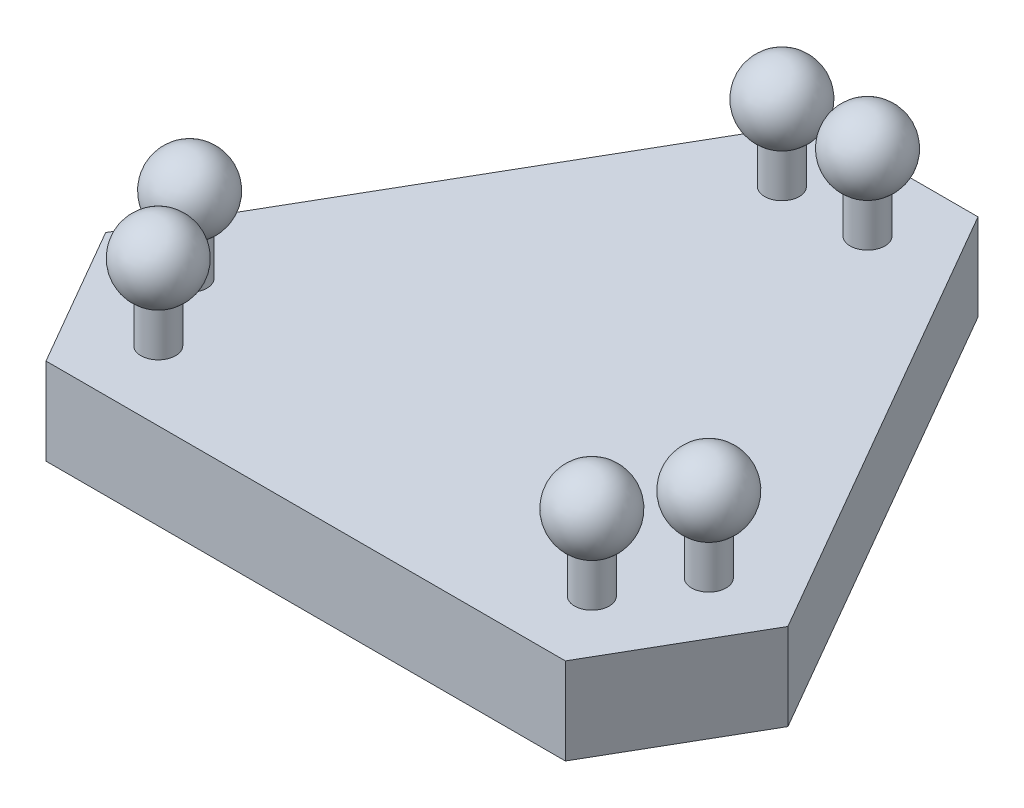
ISO-10303-21;
HEADER;
FILE_DESCRIPTION(('STEP AP214'),'2;1');
FILE_NAME('part.step','',(''),(''),'','','');
FILE_SCHEMA(('AUTOMOTIVE_DESIGN { 1 0 10303 214 1 1 1 1 }'));
ENDSEC;
DATA;
#1=APPLICATION_CONTEXT('core data for automotive mechanical design processes');
#2=APPLICATION_PROTOCOL_DEFINITION('international standard','automotive_design',2000,#1);
#3=PRODUCT_CONTEXT('',#1,'mechanical');
#4=PRODUCT('Part','Part','',(#3));
#5=PRODUCT_RELATED_PRODUCT_CATEGORY('part','',(#4));
#6=PRODUCT_DEFINITION_FORMATION('','',#4);
#7=PRODUCT_DEFINITION_CONTEXT('part definition',#1,'design');
#8=PRODUCT_DEFINITION('design','',#6,#7);
#9=PRODUCT_DEFINITION_SHAPE('','',#8);
#10=(LENGTH_UNIT() NAMED_UNIT(*) SI_UNIT(.MILLI.,.METRE.));
#11=(NAMED_UNIT(*) PLANE_ANGLE_UNIT() SI_UNIT($,.RADIAN.));
#12=(NAMED_UNIT(*) SI_UNIT($,.STERADIAN.) SOLID_ANGLE_UNIT());
#13=UNCERTAINTY_MEASURE_WITH_UNIT(LENGTH_MEASURE(1.E-05),#10,'distance_accuracy_value','');
#14=(GEOMETRIC_REPRESENTATION_CONTEXT(3) GLOBAL_UNCERTAINTY_ASSIGNED_CONTEXT((#13)) GLOBAL_UNIT_ASSIGNED_CONTEXT((#10,
#11,#12)) REPRESENTATION_CONTEXT('',''));
#15=CARTESIAN_POINT('',(0.,0.,0.));
#16=DIRECTION('',(0.,0.,1.));
#17=DIRECTION('',(1.,0.,0.));
#18=AXIS2_PLACEMENT_3D('',#15,#16,#17);
#19=CARTESIAN_POINT('',(-9.39181935057106,10.,-40.));
#20=DIRECTION('',(0.,0.,1.));
#21=DIRECTION('',(1.,0.,0.));
#22=AXIS2_PLACEMENT_3D('',#19,#20,#21);
#23=PLANE('',#22);
#24=DIRECTION('',(-1.,0.,0.));
#25=VECTOR('',#24,1.);
#26=CARTESIAN_POINT('',(-9.39181935057106,0.,-40.));
#27=LINE('',#26,#25);
#28=CARTESIAN_POINT('',(9.39181935056225,0.,-40.));
#29=VERTEX_POINT('',#28);
#30=CARTESIAN_POINT('',(-9.39181935057106,0.,-40.));
#31=VERTEX_POINT('',#30);
#32=EDGE_CURVE('E119',#29,#31,#27,.T.);
#33=ORIENTED_EDGE('',*,*,#32,.T.);
#34=DIRECTION('',(0.,-1.,0.));
#35=VECTOR('',#34,1.);
#36=CARTESIAN_POINT('',(-9.39181935057106,10.,-40.));
#37=LINE('',#36,#35);
#38=CARTESIAN_POINT('',(-9.39181935057106,10.,-40.));
#39=VERTEX_POINT('',#38);
#40=EDGE_CURVE('E11',#39,#31,#37,.T.);
#41=ORIENTED_EDGE('',*,*,#40,.F.);
#42=DIRECTION('',(-1.,0.,0.));
#43=VECTOR('',#42,1.);
#44=CARTESIAN_POINT('',(-9.39181935057106,10.,-40.));
#45=LINE('',#44,#43);
#46=CARTESIAN_POINT('',(9.39181935056225,10.,-40.));
#47=VERTEX_POINT('',#46);
#48=EDGE_CURVE('E130',#47,#39,#45,.T.);
#49=ORIENTED_EDGE('',*,*,#48,.F.);
#50=DIRECTION('',(0.,-1.,0.));
#51=VECTOR('',#50,1.);
#52=CARTESIAN_POINT('',(9.39181935056225,10.,-40.));
#53=LINE('',#52,#51);
#54=EDGE_CURVE('E115',#47,#29,#53,.T.);
#55=ORIENTED_EDGE('',*,*,#54,.T.);
#56=EDGE_LOOP('',(#33,#41,#49,#55));
#57=FACE_BOUND('',#56,.T.);
#58=ADVANCED_FACE('F32',(#57),#23,.F.);
#59=CARTESIAN_POINT('',(-9.39181935057106,10.,-40.));
#60=DIRECTION('',(0.866025403784503,0.,0.49999999999989));
#61=DIRECTION('',(0.49999999999989,0.,-0.866025403784503));
#62=AXIS2_PLACEMENT_3D('',#59,#60,#61);
#63=PLANE('',#62);
#64=DIRECTION('',(-0.499999999999889,0.,0.866025403784502));
#65=VECTOR('',#64,1.);
#66=CARTESIAN_POINT('',(-9.39181935057106,0.,-40.));
#67=LINE('',#66,#65);
#68=CARTESIAN_POINT('',(-39.3369258266587,0.,11.8664458546588));
#69=VERTEX_POINT('',#68);
#70=EDGE_CURVE('E122',#31,#69,#67,.T.);
#71=ORIENTED_EDGE('',*,*,#70,.T.);
#72=DIRECTION('',(0.,-1.,0.));
#73=VECTOR('',#72,1.);
#74=CARTESIAN_POINT('',(-39.3369258266587,10.,11.8664458546588));
#75=LINE('',#74,#73);
#76=CARTESIAN_POINT('',(-39.3369258266587,10.,11.8664458546588));
#77=VERTEX_POINT('',#76);
#78=EDGE_CURVE('E42',#77,#69,#75,.T.);
#79=ORIENTED_EDGE('',*,*,#78,.F.);
#80=DIRECTION('',(-0.499999999999889,0.,0.866025403784502));
#81=VECTOR('',#80,1.);
#82=CARTESIAN_POINT('',(-9.39181935057106,10.,-40.));
#83=LINE('',#82,#81);
#84=EDGE_CURVE('E88',#39,#77,#83,.T.);
#85=ORIENTED_EDGE('',*,*,#84,.F.);
#86=ORIENTED_EDGE('',*,*,#40,.T.);
#87=EDGE_LOOP('',(#71,#79,#85,#86));
#88=FACE_BOUND('',#87,.T.);
#89=ADVANCED_FACE('F180',(#88),#63,.F.);
#90=CARTESIAN_POINT('',(-29.945106476092,10.,28.1335541453488));
#91=DIRECTION('',(0.866025403784438,0.,-0.500000000000001));
#92=DIRECTION('',(-0.500000000000001,0.,-0.866025403784438));
#93=AXIS2_PLACEMENT_3D('',#90,#91,#92);
#94=PLANE('',#93);
#95=DIRECTION('',(0.500000000000001,0.,0.866025403784438));
#96=VECTOR('',#95,1.);
#97=CARTESIAN_POINT('',(-29.945106476092,0.,28.1335541453488));
#98=LINE('',#97,#96);
#99=CARTESIAN_POINT('',(-29.945106476092,0.,28.1335541453488));
#100=VERTEX_POINT('',#99);
#101=EDGE_CURVE('E125',#69,#100,#98,.T.);
#102=ORIENTED_EDGE('',*,*,#101,.T.);
#103=DIRECTION('',(0.,-1.,0.));
#104=VECTOR('',#103,1.);
#105=CARTESIAN_POINT('',(-29.945106476092,10.,28.1335541453488));
#106=LINE('',#105,#104);
#107=CARTESIAN_POINT('',(-29.945106476092,10.,28.1335541453488));
#108=VERTEX_POINT('',#107);
#109=EDGE_CURVE('E110',#108,#100,#106,.T.);
#110=ORIENTED_EDGE('',*,*,#109,.F.);
#111=DIRECTION('',(0.500000000000001,0.,0.866025403784438));
#112=VECTOR('',#111,1.);
#113=CARTESIAN_POINT('',(-29.945106476092,10.,28.1335541453488));
#114=LINE('',#113,#112);
#115=EDGE_CURVE('E101',#77,#108,#114,.T.);
#116=ORIENTED_EDGE('',*,*,#115,.F.);
#117=ORIENTED_EDGE('',*,*,#78,.T.);
#118=EDGE_LOOP('',(#102,#110,#116,#117));
#119=FACE_BOUND('',#118,.T.);
#120=ADVANCED_FACE('F183',(#119),#94,.F.);
#121=CARTESIAN_POINT('',(-29.945106476092,10.,28.1335541453488));
#122=DIRECTION('',(-1.27793834730888E-13,0.,-1.));
#123=DIRECTION('',(-1.,0.,1.27793834730888E-13));
#124=AXIS2_PLACEMENT_3D('',#121,#122,#123);
#125=PLANE('',#124);
#126=DIRECTION('',(1.,0.,-1.27793834730888E-13));
#127=VECTOR('',#126,1.);
#128=CARTESIAN_POINT('',(-29.945106476092,0.,28.1335541453488));
#129=LINE('',#128,#127);
#130=CARTESIAN_POINT('',(29.9451064760964,0.,28.1335541453412));
#131=VERTEX_POINT('',#130);
#132=EDGE_CURVE('E109',#100,#131,#129,.T.);
#133=ORIENTED_EDGE('',*,*,#132,.T.);
#134=DIRECTION('',(0.,-1.,0.));
#135=VECTOR('',#134,1.);
#136=CARTESIAN_POINT('',(29.9451064760964,10.,28.1335541453412));
#137=LINE('',#136,#135);
#138=CARTESIAN_POINT('',(29.9451064760964,10.,28.1335541453412));
#139=VERTEX_POINT('',#138);
#140=EDGE_CURVE('E106',#139,#131,#137,.T.);
#141=ORIENTED_EDGE('',*,*,#140,.F.);
#142=DIRECTION('',(1.,0.,-1.27793834730888E-13));
#143=VECTOR('',#142,1.);
#144=CARTESIAN_POINT('',(-29.945106476092,10.,28.1335541453488));
#145=LINE('',#144,#143);
#146=EDGE_CURVE('E95',#108,#139,#145,.T.);
#147=ORIENTED_EDGE('',*,*,#146,.F.);
#148=ORIENTED_EDGE('',*,*,#109,.T.);
#149=EDGE_LOOP('',(#133,#141,#147,#148));
#150=FACE_BOUND('',#149,.T.);
#151=ADVANCED_FACE('F107',(#150),#125,.F.);
#152=CARTESIAN_POINT('',(39.3369258266631,10.,11.8664458546512));
#153=DIRECTION('',(-0.866025403784438,0.,-0.5));
#154=DIRECTION('',(-0.5,0.,0.866025403784438));
#155=AXIS2_PLACEMENT_3D('',#152,#153,#154);
#156=PLANE('',#155);
#157=DIRECTION('',(0.5,0.,-0.866025403784438));
#158=VECTOR('',#157,1.);
#159=CARTESIAN_POINT('',(39.3369258266631,0.,11.8664458546512));
#160=LINE('',#159,#158);
#161=CARTESIAN_POINT('',(39.3369258266631,0.,11.8664458546512));
#162=VERTEX_POINT('',#161);
#163=EDGE_CURVE('E74',#131,#162,#160,.T.);
#164=ORIENTED_EDGE('',*,*,#163,.T.);
#165=DIRECTION('',(0.,-1.,0.));
#166=VECTOR('',#165,1.);
#167=CARTESIAN_POINT('',(39.3369258266631,10.,11.8664458546512));
#168=LINE('',#167,#166);
#169=CARTESIAN_POINT('',(39.3369258266631,10.,11.8664458546512));
#170=VERTEX_POINT('',#169);
#171=EDGE_CURVE('E111',#170,#162,#168,.T.);
#172=ORIENTED_EDGE('',*,*,#171,.F.);
#173=DIRECTION('',(0.5,0.,-0.866025403784438));
#174=VECTOR('',#173,1.);
#175=CARTESIAN_POINT('',(39.3369258266631,10.,11.8664458546512));
#176=LINE('',#175,#174);
#177=EDGE_CURVE('E99',#139,#170,#176,.T.);
#178=ORIENTED_EDGE('',*,*,#177,.F.);
#179=ORIENTED_EDGE('',*,*,#140,.T.);
#180=EDGE_LOOP('',(#164,#172,#178,#179));
#181=FACE_BOUND('',#180,.T.);
#182=ADVANCED_FACE('F113',(#181),#156,.F.);
#183=CARTESIAN_POINT('',(39.3369258266631,10.,11.8664458546512));
#184=DIRECTION('',(-0.866025403784375,0.,0.50000000000011));
#185=DIRECTION('',(0.50000000000011,0.,0.866025403784375));
#186=AXIS2_PLACEMENT_3D('',#183,#184,#185);
#187=PLANE('',#186);
#188=DIRECTION('',(-0.50000000000011,0.,-0.866025403784375));
#189=VECTOR('',#188,1.);
#190=CARTESIAN_POINT('',(39.3369258266631,0.,11.8664458546512));
#191=LINE('',#190,#189);
#192=EDGE_CURVE('E80',#162,#29,#191,.T.);
#193=ORIENTED_EDGE('',*,*,#192,.T.);
#194=ORIENTED_EDGE('',*,*,#54,.F.);
#195=DIRECTION('',(-0.50000000000011,0.,-0.866025403784375));
#196=VECTOR('',#195,1.);
#197=CARTESIAN_POINT('',(39.3369258266631,10.,11.8664458546512));
#198=LINE('',#197,#196);
#199=EDGE_CURVE('E51',#170,#47,#198,.T.);
#200=ORIENTED_EDGE('',*,*,#199,.F.);
#201=ORIENTED_EDGE('',*,*,#171,.T.);
#202=EDGE_LOOP('',(#193,#194,#200,#201));
#203=FACE_BOUND('',#202,.T.);
#204=ADVANCED_FACE('F188',(#203),#187,.F.);
#205=CARTESIAN_POINT('',(0.,10.,0.));
#206=DIRECTION('',(0.,1.,0.));
#207=DIRECTION('',(0.,0.,1.));
#208=AXIS2_PLACEMENT_3D('',#205,#206,#207);
#209=PLANE('',#208);
#210=CARTESIAN_POINT('',(25.000000000001,10.,20.133554145342));
#211=DIRECTION('',(0.,1.,0.));
#212=DIRECTION('',(0.,0.,1.));
#213=AXIS2_PLACEMENT_3D('',#210,#211,#212);
#214=CIRCLE('',#213,1.99999999999999);
#215=CARTESIAN_POINT('',(25.000000000001,10.,22.133554145342));
#216=VERTEX_POINT('',#215);
#217=EDGE_CURVE('E155',#216,#216,#214,.T.);
#218=ORIENTED_EDGE('',*,*,#217,.F.);
#219=EDGE_LOOP('',(#218));
#220=FACE_BOUND('',#219,.T.);
#221=CARTESIAN_POINT('',(-24.999999999999,10.,20.1335541453479));
#222=DIRECTION('',(0.,1.,0.));
#223=DIRECTION('',(0.,0.,1.));
#224=AXIS2_PLACEMENT_3D('',#221,#222,#223);
#225=CIRCLE('',#224,2.);
#226=CARTESIAN_POINT('',(-24.999999999999,10.,22.1335541453479));
#227=VERTEX_POINT('',#226);
#228=EDGE_CURVE('E154',#227,#227,#225,.T.);
#229=ORIENTED_EDGE('',*,*,#228,.F.);
#230=EDGE_LOOP('',(#229));
#231=FACE_BOUND('',#230,.T.);
#232=CARTESIAN_POINT('',(4.93616935833503,10.,-31.7174121672829));
#233=DIRECTION('',(0.,1.,0.));
#234=DIRECTION('',(0.,0.,1.));
#235=AXIS2_PLACEMENT_3D('',#232,#233,#234);
#236=CIRCLE('',#235,2.);
#237=CARTESIAN_POINT('',(4.93616935833503,10.,-29.7174121672829));
#238=VERTEX_POINT('',#237);
#239=EDGE_CURVE('E149',#238,#238,#236,.T.);
#240=ORIENTED_EDGE('',*,*,#239,.F.);
#241=EDGE_LOOP('',(#240));
#242=FACE_BOUND('',#241,.T.);
#243=CARTESIAN_POINT('',(29.9361693583404,10.,11.583858021936));
#244=DIRECTION('',(0.,1.,0.));
#245=DIRECTION('',(0.,0.,1.));
#246=AXIS2_PLACEMENT_3D('',#243,#244,#245);
#247=CIRCLE('',#246,2.);
#248=CARTESIAN_POINT('',(29.9361693583404,10.,13.583858021936));
#249=VERTEX_POINT('',#248);
#250=EDGE_CURVE('E148',#249,#249,#247,.T.);
#251=ORIENTED_EDGE('',*,*,#250,.F.);
#252=EDGE_LOOP('',(#251));
#253=FACE_BOUND('',#252,.T.);
#254=CARTESIAN_POINT('',(-29.9361693583361,10.,11.5838580219411));
#255=DIRECTION('',(0.,1.,0.));
#256=DIRECTION('',(0.,0.,1.));
#257=AXIS2_PLACEMENT_3D('',#254,#255,#256);
#258=CIRCLE('',#257,2.);
#259=CARTESIAN_POINT('',(-29.9361693583361,10.,13.5838580219411));
#260=VERTEX_POINT('',#259);
#261=EDGE_CURVE('E140',#260,#260,#258,.T.);
#262=ORIENTED_EDGE('',*,*,#261,.F.);
#263=EDGE_LOOP('',(#262));
#264=FACE_BOUND('',#263,.T.);
#265=CARTESIAN_POINT('',(-4.93616935834163,10.,-31.717412167284));
#266=DIRECTION('',(0.,1.,0.));
#267=DIRECTION('',(0.,0.,1.));
#268=AXIS2_PLACEMENT_3D('',#265,#266,#267);
#269=CIRCLE('',#268,2.00000000000001);
#270=CARTESIAN_POINT('',(-4.93616935834163,10.,-29.717412167284));
#271=VERTEX_POINT('',#270);
#272=EDGE_CURVE('E139',#271,#271,#269,.T.);
#273=ORIENTED_EDGE('',*,*,#272,.F.);
#274=EDGE_LOOP('',(#273));
#275=FACE_BOUND('',#274,.T.);
#276=ORIENTED_EDGE('',*,*,#48,.T.);
#277=ORIENTED_EDGE('',*,*,#84,.T.);
#278=ORIENTED_EDGE('',*,*,#115,.T.);
#279=ORIENTED_EDGE('',*,*,#146,.T.);
#280=ORIENTED_EDGE('',*,*,#177,.T.);
#281=ORIENTED_EDGE('',*,*,#199,.T.);
#282=EDGE_LOOP('',(#276,#277,#278,#279,#280,#281));
#283=FACE_BOUND('',#282,.T.);
#284=ADVANCED_FACE('F97',(#220,#231,#242,#253,#264,#275,#283),#209,.T.);
#285=CARTESIAN_POINT('',(0.,0.,0.));
#286=DIRECTION('',(0.,1.,0.));
#287=DIRECTION('',(0.,0.,1.));
#288=AXIS2_PLACEMENT_3D('',#285,#286,#287);
#289=PLANE('',#288);
#290=CARTESIAN_POINT('',(0.,0.,0.));
#291=DIRECTION('',(0.,1.,0.));
#292=DIRECTION('',(-1.,0.,0.));
#293=AXIS2_PLACEMENT_3D('',#290,#291,#292);
#294=CIRCLE('',#293,15.);
#295=CARTESIAN_POINT('',(-15.,0.,0.));
#296=VERTEX_POINT('',#295);
#297=EDGE_CURVE('E144',#296,#296,#294,.T.);
#298=ORIENTED_EDGE('',*,*,#297,.T.);
#299=EDGE_LOOP('',(#298));
#300=FACE_BOUND('',#299,.T.);
#301=ORIENTED_EDGE('',*,*,#32,.F.);
#302=ORIENTED_EDGE('',*,*,#192,.F.);
#303=ORIENTED_EDGE('',*,*,#163,.F.);
#304=ORIENTED_EDGE('',*,*,#132,.F.);
#305=ORIENTED_EDGE('',*,*,#101,.F.);
#306=ORIENTED_EDGE('',*,*,#70,.F.);
#307=EDGE_LOOP('',(#301,#302,#303,#304,#305,#306));
#308=FACE_BOUND('',#307,.T.);
#309=ADVANCED_FACE('F186',(#300,#308),#289,.F.);
#310=CARTESIAN_POINT('',(0.,-20.,0.));
#311=DIRECTION('',(0.,-1.,0.));
#312=DIRECTION('',(1.,0.,0.));
#313=AXIS2_PLACEMENT_3D('',#310,#311,#312);
#314=PLANE('',#313);
#315=CARTESIAN_POINT('',(0.,-20.,0.));
#316=DIRECTION('',(0.,1.,0.));
#317=DIRECTION('',(-1.,0.,0.));
#318=AXIS2_PLACEMENT_3D('',#315,#316,#317);
#319=CIRCLE('',#318,0.301325351432847);
#320=CARTESIAN_POINT('',(-0.301325351432842,-20.,0.));
#321=VERTEX_POINT('',#320);
#322=EDGE_CURVE('E123',#321,#321,#319,.T.);
#323=ORIENTED_EDGE('',*,*,#322,.F.);
#324=EDGE_LOOP('',(#323));
#325=FACE_BOUND('',#324,.T.);
#326=ADVANCED_FACE('F258',(#325),#314,.T.);
#327=CARTESIAN_POINT('',(0.,0.,0.));
#328=DIRECTION('',(0.,1.,0.));
#329=DIRECTION('',(-1.,0.,0.));
#330=AXIS2_PLACEMENT_3D('',#327,#328,#329);
#331=CONICAL_SURFACE('',#330,15.,0.633788762912951);
#332=CARTESIAN_POINT('',(-0.301325351432842,-20.,0.));
#333=CARTESIAN_POINT('',(-0.45443654568875,-19.7916666666667,0.));
#334=CARTESIAN_POINT('',(-0.607547739944658,-19.5833333333333,0.));
#335=CARTESIAN_POINT('',(-0.913770128456474,-19.1666666666667,0.));
#336=CARTESIAN_POINT('',(-1.06688132271238,-18.9583333333333,0.));
#337=CARTESIAN_POINT('',(-1.3731037112242,-18.5416666666667,0.));
#338=CARTESIAN_POINT('',(-1.52621490548011,-18.3333333333333,0.));
#339=CARTESIAN_POINT('',(-1.83243729399192,-17.9166666666667,0.));
#340=CARTESIAN_POINT('',(-1.98554848824783,-17.7083333333333,0.));
#341=CARTESIAN_POINT('',(-2.29177087675965,-17.2916666666667,0.));
#342=CARTESIAN_POINT('',(-2.44488207101555,-17.0833333333333,0.));
#343=CARTESIAN_POINT('',(-2.75110445952737,-16.6666666666667,0.));
#344=CARTESIAN_POINT('',(-2.90421565378328,-16.4583333333333,0.));
#345=CARTESIAN_POINT('',(-3.21043804229509,-16.0416666666667,0.));
#346=CARTESIAN_POINT('',(-3.363549236551,-15.8333333333333,0.));
#347=CARTESIAN_POINT('',(-3.66977162506282,-15.4166666666667,0.));
#348=CARTESIAN_POINT('',(-3.82288281931872,-15.2083333333333,0.));
#349=CARTESIAN_POINT('',(-4.12910520783054,-14.7916666666667,0.));
#350=CARTESIAN_POINT('',(-4.28221640208645,-14.5833333333333,0.));
#351=CARTESIAN_POINT('',(-4.58843879059826,-14.1666666666667,0.));
#352=CARTESIAN_POINT('',(-4.74154998485417,-13.9583333333333,0.));
#353=CARTESIAN_POINT('',(-5.04777237336599,-13.5416666666667,0.));
#354=CARTESIAN_POINT('',(-5.20088356762189,-13.3333333333333,0.));
#355=CARTESIAN_POINT('',(-5.50710595613371,-12.9166666666667,0.));
#356=CARTESIAN_POINT('',(-5.66021715038962,-12.7083333333333,0.));
#357=CARTESIAN_POINT('',(-5.96643953890143,-12.2916666666667,0.));
#358=CARTESIAN_POINT('',(-6.11955073315734,-12.0833333333333,0.));
#359=CARTESIAN_POINT('',(-6.42577312166916,-11.6666666666667,0.));
#360=CARTESIAN_POINT('',(-6.57888431592507,-11.4583333333333,0.));
#361=CARTESIAN_POINT('',(-6.88510670443688,-11.0416666666667,0.));
#362=CARTESIAN_POINT('',(-7.03821789869279,-10.8333333333333,0.));
#363=CARTESIAN_POINT('',(-7.3444402872046,-10.4166666666667,0.));
#364=CARTESIAN_POINT('',(-7.49755148146051,-10.2083333333333,0.));
#365=CARTESIAN_POINT('',(-7.80377386997233,-9.79166666666667,0.));
#366=CARTESIAN_POINT('',(-7.95688506422824,-9.58333333333334,0.));
#367=CARTESIAN_POINT('',(-8.26310745274005,-9.16666666666667,0.));
#368=CARTESIAN_POINT('',(-8.41621864699596,-8.95833333333334,0.));
#369=CARTESIAN_POINT('',(-8.72244103550778,-8.54166666666667,0.));
#370=CARTESIAN_POINT('',(-8.87555222976368,-8.33333333333334,0.));
#371=CARTESIAN_POINT('',(-9.1817746182755,-7.91666666666667,0.));
#372=CARTESIAN_POINT('',(-9.33488581253141,-7.70833333333334,0.));
#373=CARTESIAN_POINT('',(-9.64110820104322,-7.29166666666667,0.));
#374=CARTESIAN_POINT('',(-9.79421939529913,-7.08333333333334,0.));
#375=CARTESIAN_POINT('',(-10.1004417838109,-6.66666666666667,0.));
#376=CARTESIAN_POINT('',(-10.2535529780669,-6.45833333333334,0.));
#377=CARTESIAN_POINT('',(-10.5597753665787,-6.04166666666667,0.));
#378=CARTESIAN_POINT('',(-10.7128865608346,-5.83333333333334,0.));
#379=CARTESIAN_POINT('',(-11.0191089493464,-5.41666666666667,0.));
#380=CARTESIAN_POINT('',(-11.1722201436023,-5.20833333333334,0.));
#381=CARTESIAN_POINT('',(-11.4784425321141,-4.79166666666667,0.));
#382=CARTESIAN_POINT('',(-11.63155372637,-4.58333333333334,0.));
#383=CARTESIAN_POINT('',(-11.9377761148818,-4.16666666666667,0.));
#384=CARTESIAN_POINT('',(-12.0908873091378,-3.95833333333333,0.));
#385=CARTESIAN_POINT('',(-12.3971096976496,-3.54166666666667,0.));
#386=CARTESIAN_POINT('',(-12.5502208919055,-3.33333333333333,0.));
#387=CARTESIAN_POINT('',(-12.8564432804173,-2.91666666666667,0.));
#388=CARTESIAN_POINT('',(-13.0095544746732,-2.70833333333334,0.));
#389=CARTESIAN_POINT('',(-13.315776863185,-2.29166666666667,0.));
#390=CARTESIAN_POINT('',(-13.4688880574409,-2.08333333333334,0.));
#391=CARTESIAN_POINT('',(-13.7751104459527,-1.66666666666667,0.));
#392=CARTESIAN_POINT('',(-13.9282216402086,-1.45833333333334,0.));
#393=CARTESIAN_POINT('',(-14.2344440287205,-1.04166666666667,0.));
#394=CARTESIAN_POINT('',(-14.3875552229764,-0.833333333333336,0.));
#395=CARTESIAN_POINT('',(-14.6937776114882,-0.416666666666669,0.));
#396=CARTESIAN_POINT('',(-14.8468888057441,-0.208333333333335,0.));
#397=CARTESIAN_POINT('',(-15.,0.,0.));
#398=B_SPLINE_CURVE_WITH_KNOTS('',3,(#332,#333,#334,#335,#336,#337,#338,#339,#340,#341,#342,
#343,#344,#345,#346,#347,#348,#349,#350,#351,#352,#353,#354,#355,#356,#357,#358,#359,#360,#361,
#362,#363,#364,#365,#366,#367,#368,#369,#370,#371,#372,#373,#374,#375,#376,#377,#378,#379,#380,
#381,#382,#383,#384,#385,#386,#387,#388,#389,#390,#391,#392,#393,#394,#395,#396,#397),
.UNSPECIFIED.,.F.,.F.,(4,2,2,2,2,2,2,2,2,2,2,2,2,2,2,2,2,2,2,2,2,2,2,2,2,2,2,2,2,2,2,2,4),(0.,
0.775636732148648,1.5512734642973,2.32691019644595,3.10254692859459,3.87818366074324,
4.65382039289189,5.42945712504054,6.20509385718918,6.98073058933783,7.75636732148648,
8.53200405363513,9.30764078578378,10.0832775179324,10.8589142500811,11.6345509822297,
12.4101877143784,13.185824446527,13.9614611786757,14.7370979108243,15.512734642973,
16.2883713751216,17.0640081072703,17.8396448394189,18.6152815715675,19.3909183037162,
20.1665550358648,20.9421917680135,21.7178285001621,22.4934652323108,23.2691019644594,
24.0447386966081,24.8203754287567),.UNSPECIFIED.);
#399=EDGE_CURVE('BSEAM254',#321,#296,#398,.T.);
#400=ORIENTED_EDGE('',*,*,#322,.T.);
#401=ORIENTED_EDGE('',*,*,#297,.F.);
#402=ORIENTED_EDGE('',*,*,#399,.T.);
#403=ORIENTED_EDGE('',*,*,#399,.F.);
#404=EDGE_LOOP('',(#400,#402,#401,#403));
#405=FACE_BOUND('',#404,.T.);
#406=ADVANCED_FACE('F254',(#405),#331,.T.);
#407=CARTESIAN_POINT('',(-4.93616935834163,15.,-31.717412167284));
#408=DIRECTION('',(0.,-1.,0.));
#409=DIRECTION('',(0.,0.,-1.));
#410=AXIS2_PLACEMENT_3D('',#407,#408,#409);
#411=CYLINDRICAL_SURFACE('',#410,2.00000000000001);
#412=CARTESIAN_POINT('',(-4.93616935834163,15.,-31.717412167284));
#413=DIRECTION('',(0.,1.,0.));
#414=DIRECTION('',(0.,0.,1.));
#415=AXIS2_PLACEMENT_3D('',#412,#413,#414);
#416=CIRCLE('',#415,2.00000000000001);
#417=CARTESIAN_POINT('',(-4.93616935834163,15.,-29.717412167284));
#418=VERTEX_POINT('',#417);
#419=EDGE_CURVE('E141',#418,#418,#416,.T.);
#420=ORIENTED_EDGE('',*,*,#419,.F.);
#421=EDGE_LOOP('',(#420));
#422=FACE_BOUND('',#421,.T.);
#423=ORIENTED_EDGE('',*,*,#272,.T.);
#424=EDGE_LOOP('',(#423));
#425=FACE_BOUND('',#424,.T.);
#426=ADVANCED_FACE('F216',(#422,#425),#411,.T.);
#427=CARTESIAN_POINT('',(-4.93616935834163,18.75,-31.717412167284));
#428=DIRECTION('',(0.,0.,1.));
#429=DIRECTION('',(1.,0.,0.));
#430=AXIS2_PLACEMENT_3D('',#427,#428,#429);
#431=SPHERICAL_SURFACE('',#430,4.25);
#432=CARTESIAN_POINT('',(-4.93616935834163,18.75,-31.717412167284));
#433=DIRECTION('',(0.,1.,0.));
#434=DIRECTION('',(0.,0.,1.));
#435=AXIS2_PLACEMENT_3D('',#432,#433,#434);
#436=SPHERICAL_SURFACE('',#435,4.25);
#437=ORIENTED_EDGE('',*,*,#419,.T.);
#438=EDGE_LOOP('',(#437));
#439=FACE_BOUND('',#438,.T.);
#440=ADVANCED_FACE('F213',(#439),#436,.T.);
#441=CARTESIAN_POINT('',(-29.9361693583361,15.,11.5838580219411));
#442=DIRECTION('',(0.,-1.,0.));
#443=DIRECTION('',(0.,0.,-1.));
#444=AXIS2_PLACEMENT_3D('',#441,#442,#443);
#445=CYLINDRICAL_SURFACE('',#444,2.);
#446=CARTESIAN_POINT('',(-29.9361693583361,15.,11.5838580219411));
#447=DIRECTION('',(0.,1.,0.));
#448=DIRECTION('',(0.,0.,1.));
#449=AXIS2_PLACEMENT_3D('',#446,#447,#448);
#450=CIRCLE('',#449,2.);
#451=CARTESIAN_POINT('',(-29.9361693583361,15.,13.5838580219411));
#452=VERTEX_POINT('',#451);
#453=EDGE_CURVE('E136',#452,#452,#450,.T.);
#454=ORIENTED_EDGE('',*,*,#453,.F.);
#455=EDGE_LOOP('',(#454));
#456=FACE_BOUND('',#455,.T.);
#457=ORIENTED_EDGE('',*,*,#261,.T.);
#458=EDGE_LOOP('',(#457));
#459=FACE_BOUND('',#458,.T.);
#460=ADVANCED_FACE('F211',(#456,#459),#445,.T.);
#461=CARTESIAN_POINT('',(-29.9361693583361,18.75,11.5838580219411));
#462=DIRECTION('',(0.,0.,1.));
#463=DIRECTION('',(1.,0.,0.));
#464=AXIS2_PLACEMENT_3D('',#461,#462,#463);
#465=SPHERICAL_SURFACE('',#464,4.25);
#466=CARTESIAN_POINT('',(-29.9361693583361,18.75,11.5838580219411));
#467=DIRECTION('',(0.,1.,0.));
#468=DIRECTION('',(0.,0.,1.));
#469=AXIS2_PLACEMENT_3D('',#466,#467,#468);
#470=SPHERICAL_SURFACE('',#469,4.25);
#471=ORIENTED_EDGE('',*,*,#453,.T.);
#472=EDGE_LOOP('',(#471));
#473=FACE_BOUND('',#472,.T.);
#474=ADVANCED_FACE('F207',(#473),#470,.T.);
#475=CARTESIAN_POINT('',(29.9361693583404,15.,11.583858021936));
#476=DIRECTION('',(0.,-1.,0.));
#477=DIRECTION('',(0.,0.,-1.));
#478=AXIS2_PLACEMENT_3D('',#475,#476,#477);
#479=CYLINDRICAL_SURFACE('',#478,2.);
#480=CARTESIAN_POINT('',(29.9361693583404,15.,11.583858021936));
#481=DIRECTION('',(0.,1.,0.));
#482=DIRECTION('',(0.,0.,1.));
#483=AXIS2_PLACEMENT_3D('',#480,#481,#482);
#484=CIRCLE('',#483,2.);
#485=CARTESIAN_POINT('',(29.9361693583404,15.,13.583858021936));
#486=VERTEX_POINT('',#485);
#487=EDGE_CURVE('E150',#486,#486,#484,.T.);
#488=ORIENTED_EDGE('',*,*,#487,.F.);
#489=EDGE_LOOP('',(#488));
#490=FACE_BOUND('',#489,.T.);
#491=ORIENTED_EDGE('',*,*,#250,.T.);
#492=EDGE_LOOP('',(#491));
#493=FACE_BOUND('',#492,.T.);
#494=ADVANCED_FACE('F210',(#490,#493),#479,.T.);
#495=CARTESIAN_POINT('',(29.9361693583404,18.75,11.583858021936));
#496=DIRECTION('',(0.,0.,1.));
#497=DIRECTION('',(1.,0.,0.));
#498=AXIS2_PLACEMENT_3D('',#495,#496,#497);
#499=SPHERICAL_SURFACE('',#498,4.25);
#500=CARTESIAN_POINT('',(29.9361693583404,18.75,11.583858021936));
#501=DIRECTION('',(0.,1.,0.));
#502=DIRECTION('',(0.,0.,1.));
#503=AXIS2_PLACEMENT_3D('',#500,#501,#502);
#504=SPHERICAL_SURFACE('',#503,4.25);
#505=ORIENTED_EDGE('',*,*,#487,.T.);
#506=EDGE_LOOP('',(#505));
#507=FACE_BOUND('',#506,.T.);
#508=ADVANCED_FACE('F224',(#507),#504,.T.);
#509=CARTESIAN_POINT('',(4.93616935833503,15.,-31.7174121672829));
#510=DIRECTION('',(0.,-1.,0.));
#511=DIRECTION('',(0.,0.,-1.));
#512=AXIS2_PLACEMENT_3D('',#509,#510,#511);
#513=CYLINDRICAL_SURFACE('',#512,2.);
#514=CARTESIAN_POINT('',(4.93616935833503,15.,-31.7174121672829));
#515=DIRECTION('',(0.,1.,0.));
#516=DIRECTION('',(0.,0.,1.));
#517=AXIS2_PLACEMENT_3D('',#514,#515,#516);
#518=CIRCLE('',#517,2.);
#519=CARTESIAN_POINT('',(4.93616935833503,15.,-29.7174121672829));
#520=VERTEX_POINT('',#519);
#521=EDGE_CURVE('E145',#520,#520,#518,.T.);
#522=ORIENTED_EDGE('',*,*,#521,.F.);
#523=EDGE_LOOP('',(#522));
#524=FACE_BOUND('',#523,.T.);
#525=ORIENTED_EDGE('',*,*,#239,.T.);
#526=EDGE_LOOP('',(#525));
#527=FACE_BOUND('',#526,.T.);
#528=ADVANCED_FACE('F222',(#524,#527),#513,.T.);
#529=CARTESIAN_POINT('',(4.93616935833503,18.75,-31.7174121672829));
#530=DIRECTION('',(0.,0.,1.));
#531=DIRECTION('',(1.,0.,0.));
#532=AXIS2_PLACEMENT_3D('',#529,#530,#531);
#533=SPHERICAL_SURFACE('',#532,4.25);
#534=CARTESIAN_POINT('',(4.93616935833503,18.75,-31.7174121672829));
#535=DIRECTION('',(0.,1.,0.));
#536=DIRECTION('',(0.,0.,1.));
#537=AXIS2_PLACEMENT_3D('',#534,#535,#536);
#538=SPHERICAL_SURFACE('',#537,4.25);
#539=ORIENTED_EDGE('',*,*,#521,.T.);
#540=EDGE_LOOP('',(#539));
#541=FACE_BOUND('',#540,.T.);
#542=ADVANCED_FACE('F218',(#541),#538,.T.);
#543=CARTESIAN_POINT('',(-24.999999999999,15.,20.1335541453479));
#544=DIRECTION('',(0.,-1.,0.));
#545=DIRECTION('',(0.,0.,-1.));
#546=AXIS2_PLACEMENT_3D('',#543,#544,#545);
#547=CYLINDRICAL_SURFACE('',#546,2.);
#548=CARTESIAN_POINT('',(-24.999999999999,15.,20.1335541453479));
#549=DIRECTION('',(0.,1.,0.));
#550=DIRECTION('',(0.,0.,1.));
#551=AXIS2_PLACEMENT_3D('',#548,#549,#550);
#552=CIRCLE('',#551,2.);
#553=CARTESIAN_POINT('',(-24.999999999999,15.,22.1335541453479));
#554=VERTEX_POINT('',#553);
#555=EDGE_CURVE('E36',#554,#554,#552,.T.);
#556=ORIENTED_EDGE('',*,*,#555,.F.);
#557=EDGE_LOOP('',(#556));
#558=FACE_BOUND('',#557,.T.);
#559=ORIENTED_EDGE('',*,*,#228,.T.);
#560=EDGE_LOOP('',(#559));
#561=FACE_BOUND('',#560,.T.);
#562=ADVANCED_FACE('F221',(#558,#561),#547,.T.);
#563=CARTESIAN_POINT('',(-24.999999999999,18.75,20.1335541453479));
#564=DIRECTION('',(0.,0.,1.));
#565=DIRECTION('',(1.,0.,0.));
#566=AXIS2_PLACEMENT_3D('',#563,#564,#565);
#567=SPHERICAL_SURFACE('',#566,4.25);
#568=CARTESIAN_POINT('',(-24.999999999999,18.75,20.1335541453479));
#569=DIRECTION('',(0.,1.,0.));
#570=DIRECTION('',(0.,0.,1.));
#571=AXIS2_PLACEMENT_3D('',#568,#569,#570);
#572=SPHERICAL_SURFACE('',#571,4.25);
#573=ORIENTED_EDGE('',*,*,#555,.T.);
#574=EDGE_LOOP('',(#573));
#575=FACE_BOUND('',#574,.T.);
#576=ADVANCED_FACE('F34',(#575),#572,.T.);
#577=CARTESIAN_POINT('',(25.000000000001,15.,20.133554145342));
#578=DIRECTION('',(0.,-1.,0.));
#579=DIRECTION('',(0.,0.,-1.));
#580=AXIS2_PLACEMENT_3D('',#577,#578,#579);
#581=CYLINDRICAL_SURFACE('',#580,1.99999999999999);
#582=CARTESIAN_POINT('',(25.000000000001,15.,20.133554145342));
#583=DIRECTION('',(0.,1.,0.));
#584=DIRECTION('',(0.,0.,1.));
#585=AXIS2_PLACEMENT_3D('',#582,#583,#584);
#586=CIRCLE('',#585,1.99999999999999);
#587=CARTESIAN_POINT('',(25.000000000001,15.,22.133554145342));
#588=VERTEX_POINT('',#587);
#589=EDGE_CURVE('E152',#588,#588,#586,.T.);
#590=ORIENTED_EDGE('',*,*,#589,.F.);
#591=EDGE_LOOP('',(#590));
#592=FACE_BOUND('',#591,.T.);
#593=ORIENTED_EDGE('',*,*,#217,.T.);
#594=EDGE_LOOP('',(#593));
#595=FACE_BOUND('',#594,.T.);
#596=ADVANCED_FACE('F229',(#592,#595),#581,.T.);
#597=CARTESIAN_POINT('',(25.000000000001,18.75,20.133554145342));
#598=DIRECTION('',(0.,0.,1.));
#599=DIRECTION('',(1.,0.,0.));
#600=AXIS2_PLACEMENT_3D('',#597,#598,#599);
#601=SPHERICAL_SURFACE('',#600,4.25);
#602=CARTESIAN_POINT('',(25.000000000001,18.75,20.133554145342));
#603=DIRECTION('',(0.,1.,0.));
#604=DIRECTION('',(0.,0.,1.));
#605=AXIS2_PLACEMENT_3D('',#602,#603,#604);
#606=SPHERICAL_SURFACE('',#605,4.25);
#607=ORIENTED_EDGE('',*,*,#589,.T.);
#608=EDGE_LOOP('',(#607));
#609=FACE_BOUND('',#608,.T.);
#610=ADVANCED_FACE('F227',(#609),#606,.T.);
#611=CLOSED_SHELL('',(#58,#89,#120,#151,#182,#204,#284,#309,#326,#406,#426,#440,#460,#474,#494,
#508,#528,#542,#562,#576,#596,#610));
#612=MANIFOLD_SOLID_BREP('B2',#611);
#613=ADVANCED_BREP_SHAPE_REPRESENTATION('',(#18,#612),#14);
#614=SHAPE_DEFINITION_REPRESENTATION(#9,#613);
ENDSEC;
END-ISO-10303-21;
